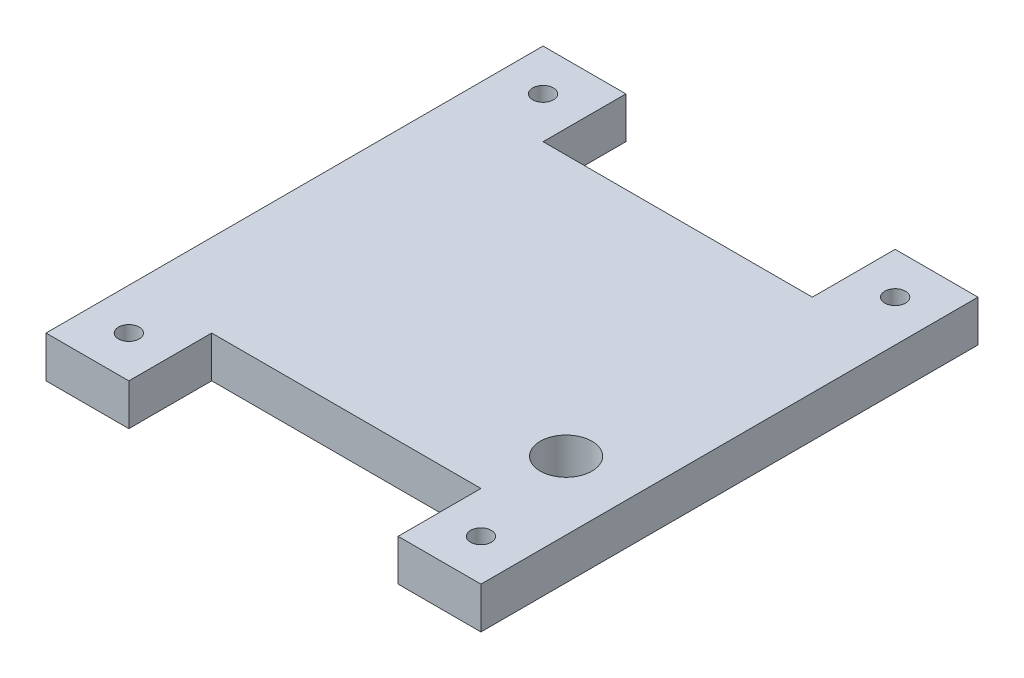
ISO-10303-21;
HEADER;
FILE_DESCRIPTION(('STEP AP214'),'2;1');
FILE_NAME('part.step','',(''),(''),'','','');
FILE_SCHEMA(('AUTOMOTIVE_DESIGN { 1 0 10303 214 1 1 1 1 }'));
ENDSEC;
DATA;
#1=APPLICATION_CONTEXT('core data for automotive mechanical design processes');
#2=APPLICATION_PROTOCOL_DEFINITION('international standard','automotive_design',2000,#1);
#3=PRODUCT_CONTEXT('',#1,'mechanical');
#4=PRODUCT('Part','Part','',(#3));
#5=PRODUCT_RELATED_PRODUCT_CATEGORY('part','',(#4));
#6=PRODUCT_DEFINITION_FORMATION('','',#4);
#7=PRODUCT_DEFINITION_CONTEXT('part definition',#1,'design');
#8=PRODUCT_DEFINITION('design','',#6,#7);
#9=PRODUCT_DEFINITION_SHAPE('','',#8);
#10=(LENGTH_UNIT() NAMED_UNIT(*) SI_UNIT(.MILLI.,.METRE.));
#11=(NAMED_UNIT(*) PLANE_ANGLE_UNIT() SI_UNIT($,.RADIAN.));
#12=(NAMED_UNIT(*) SI_UNIT($,.STERADIAN.) SOLID_ANGLE_UNIT());
#13=UNCERTAINTY_MEASURE_WITH_UNIT(LENGTH_MEASURE(1.E-05),#10,'distance_accuracy_value','');
#14=(GEOMETRIC_REPRESENTATION_CONTEXT(3) GLOBAL_UNCERTAINTY_ASSIGNED_CONTEXT((#13)) GLOBAL_UNIT_ASSIGNED_CONTEXT((#10,
#11,#12)) REPRESENTATION_CONTEXT('',''));
#15=CARTESIAN_POINT('',(0.,0.,0.));
#16=DIRECTION('',(0.,0.,1.));
#17=DIRECTION('',(1.,0.,0.));
#18=AXIS2_PLACEMENT_3D('',#15,#16,#17);
#19=CARTESIAN_POINT('',(10.9671828152516,6.24877820473917,0.));
#20=DIRECTION('',(1.,0.,0.));
#21=DIRECTION('',(0.,0.,-1.));
#22=AXIS2_PLACEMENT_3D('',#19,#20,#21);
#23=PLANE('',#22);
#24=DIRECTION('',(0.,0.,1.));
#25=VECTOR('',#24,1.);
#26=CARTESIAN_POINT('',(10.9671828152516,4.24877820473917,0.));
#27=LINE('',#26,#25);
#28=CARTESIAN_POINT('',(10.9671828152516,4.24877820473917,-11.5586342220204));
#29=VERTEX_POINT('',#28);
#30=CARTESIAN_POINT('',(10.9671828152516,4.24877820473917,12.4413657779796));
#31=VERTEX_POINT('',#30);
#32=EDGE_CURVE('E174',#29,#31,#27,.T.);
#33=ORIENTED_EDGE('',*,*,#32,.T.);
#34=DIRECTION('',(0.,-1.,0.));
#35=VECTOR('',#34,1.);
#36=CARTESIAN_POINT('',(10.9671828152516,6.24877820473917,12.4413657779796));
#37=LINE('',#36,#35);
#38=CARTESIAN_POINT('',(10.9671828152516,6.24877820473917,12.4413657779796));
#39=VERTEX_POINT('',#38);
#40=EDGE_CURVE('E11',#39,#31,#37,.T.);
#41=ORIENTED_EDGE('',*,*,#40,.F.);
#42=DIRECTION('',(0.,0.,1.));
#43=VECTOR('',#42,1.);
#44=CARTESIAN_POINT('',(10.9671828152516,6.24877820473917,0.));
#45=LINE('',#44,#43);
#46=CARTESIAN_POINT('',(10.9671828152516,6.24877820473917,-11.5586342220204));
#47=VERTEX_POINT('',#46);
#48=EDGE_CURVE('E209',#47,#39,#45,.T.);
#49=ORIENTED_EDGE('',*,*,#48,.F.);
#50=DIRECTION('',(0.,-1.,0.));
#51=VECTOR('',#50,1.);
#52=CARTESIAN_POINT('',(10.9671828152516,6.24877820473917,-11.5586342220204));
#53=LINE('',#52,#51);
#54=EDGE_CURVE('E173',#47,#29,#53,.T.);
#55=ORIENTED_EDGE('',*,*,#54,.T.);
#56=EDGE_LOOP('',(#33,#41,#49,#55));
#57=FACE_BOUND('',#56,.T.);
#58=ADVANCED_FACE('F41',(#57),#23,.F.);
#59=CARTESIAN_POINT('',(0.,6.24877820473917,12.4413657779796));
#60=DIRECTION('',(0.,0.,-1.));
#61=DIRECTION('',(-1.,0.,0.));
#62=AXIS2_PLACEMENT_3D('',#59,#60,#61);
#63=PLANE('',#62);
#64=DIRECTION('',(1.,0.,0.));
#65=VECTOR('',#64,1.);
#66=CARTESIAN_POINT('',(0.,4.24877820473917,12.4413657779796));
#67=LINE('',#66,#65);
#68=CARTESIAN_POINT('',(14.9671828152516,4.24877820473917,12.4413657779796));
#69=VERTEX_POINT('',#68);
#70=EDGE_CURVE('E177',#31,#69,#67,.T.);
#71=ORIENTED_EDGE('',*,*,#70,.T.);
#72=DIRECTION('',(0.,-1.,0.));
#73=VECTOR('',#72,1.);
#74=CARTESIAN_POINT('',(14.9671828152516,6.24877820473917,12.4413657779796));
#75=LINE('',#74,#73);
#76=CARTESIAN_POINT('',(14.9671828152516,6.24877820473917,12.4413657779796));
#77=VERTEX_POINT('',#76);
#78=EDGE_CURVE('E49',#77,#69,#75,.T.);
#79=ORIENTED_EDGE('',*,*,#78,.F.);
#80=DIRECTION('',(1.,0.,0.));
#81=VECTOR('',#80,1.);
#82=CARTESIAN_POINT('',(0.,6.24877820473917,12.4413657779796));
#83=LINE('',#82,#81);
#84=EDGE_CURVE('E112',#39,#77,#83,.T.);
#85=ORIENTED_EDGE('',*,*,#84,.F.);
#86=ORIENTED_EDGE('',*,*,#40,.T.);
#87=EDGE_LOOP('',(#71,#79,#85,#86));
#88=FACE_BOUND('',#87,.T.);
#89=ADVANCED_FACE('F293',(#88),#63,.F.);
#90=CARTESIAN_POINT('',(14.9671828152516,6.24877820473917,0.));
#91=DIRECTION('',(-1.,0.,0.));
#92=DIRECTION('',(0.,0.,1.));
#93=AXIS2_PLACEMENT_3D('',#90,#91,#92);
#94=PLANE('',#93);
#95=DIRECTION('',(0.,0.,-1.));
#96=VECTOR('',#95,1.);
#97=CARTESIAN_POINT('',(14.9671828152516,4.24877820473917,0.));
#98=LINE('',#97,#96);
#99=CARTESIAN_POINT('',(14.9671828152516,4.24877820473917,8.44136577797956));
#100=VERTEX_POINT('',#99);
#101=EDGE_CURVE('E180',#69,#100,#98,.T.);
#102=ORIENTED_EDGE('',*,*,#101,.T.);
#103=DIRECTION('',(0.,-1.,0.));
#104=VECTOR('',#103,1.);
#105=CARTESIAN_POINT('',(14.9671828152516,6.24877820473917,8.44136577797956));
#106=LINE('',#105,#104);
#107=CARTESIAN_POINT('',(14.9671828152516,6.24877820473917,8.44136577797956));
#108=VERTEX_POINT('',#107);
#109=EDGE_CURVE('E228',#108,#100,#106,.T.);
#110=ORIENTED_EDGE('',*,*,#109,.F.);
#111=DIRECTION('',(0.,0.,-1.));
#112=VECTOR('',#111,1.);
#113=CARTESIAN_POINT('',(14.9671828152516,6.24877820473917,0.));
#114=LINE('',#113,#112);
#115=EDGE_CURVE('E236',#77,#108,#114,.T.);
#116=ORIENTED_EDGE('',*,*,#115,.F.);
#117=ORIENTED_EDGE('',*,*,#78,.T.);
#118=EDGE_LOOP('',(#102,#110,#116,#117));
#119=FACE_BOUND('',#118,.T.);
#120=ADVANCED_FACE('F234',(#119),#94,.F.);
#121=CARTESIAN_POINT('',(0.,6.24877820473917,8.44136577797956));
#122=DIRECTION('',(0.,0.,-1.));
#123=DIRECTION('',(-1.,0.,0.));
#124=AXIS2_PLACEMENT_3D('',#121,#122,#123);
#125=PLANE('',#124);
#126=DIRECTION('',(1.,0.,0.));
#127=VECTOR('',#126,1.);
#128=CARTESIAN_POINT('',(0.,4.24877820473917,8.44136577797956));
#129=LINE('',#128,#127);
#130=CARTESIAN_POINT('',(27.9671828152516,4.24877820473917,8.44136577797956));
#131=VERTEX_POINT('',#130);
#132=EDGE_CURVE('E182',#100,#131,#129,.T.);
#133=ORIENTED_EDGE('',*,*,#132,.T.);
#134=DIRECTION('',(0.,-1.,0.));
#135=VECTOR('',#134,1.);
#136=CARTESIAN_POINT('',(27.9671828152516,6.24877820473917,8.44136577797956));
#137=LINE('',#136,#135);
#138=CARTESIAN_POINT('',(27.9671828152516,6.24877820473917,8.44136577797956));
#139=VERTEX_POINT('',#138);
#140=EDGE_CURVE('E225',#139,#131,#137,.T.);
#141=ORIENTED_EDGE('',*,*,#140,.F.);
#142=DIRECTION('',(1.,0.,0.));
#143=VECTOR('',#142,1.);
#144=CARTESIAN_POINT('',(0.,6.24877820473917,8.44136577797956));
#145=LINE('',#144,#143);
#146=EDGE_CURVE('E255',#108,#139,#145,.T.);
#147=ORIENTED_EDGE('',*,*,#146,.F.);
#148=ORIENTED_EDGE('',*,*,#109,.T.);
#149=EDGE_LOOP('',(#133,#141,#147,#148));
#150=FACE_BOUND('',#149,.T.);
#151=ADVANCED_FACE('F246',(#150),#125,.F.);
#152=CARTESIAN_POINT('',(27.9671828152516,6.24877820473917,0.));
#153=DIRECTION('',(1.,0.,0.));
#154=DIRECTION('',(0.,0.,-1.));
#155=AXIS2_PLACEMENT_3D('',#152,#153,#154);
#156=PLANE('',#155);
#157=DIRECTION('',(0.,0.,1.));
#158=VECTOR('',#157,1.);
#159=CARTESIAN_POINT('',(27.9671828152516,4.24877820473917,0.));
#160=LINE('',#159,#158);
#161=CARTESIAN_POINT('',(27.9671828152516,4.24877820473917,12.4413657779796));
#162=VERTEX_POINT('',#161);
#163=EDGE_CURVE('E184',#131,#162,#160,.T.);
#164=ORIENTED_EDGE('',*,*,#163,.T.);
#165=DIRECTION('',(0.,-1.,0.));
#166=VECTOR('',#165,1.);
#167=CARTESIAN_POINT('',(27.9671828152516,6.24877820473917,12.4413657779796));
#168=LINE('',#167,#166);
#169=CARTESIAN_POINT('',(27.9671828152516,6.24877820473917,12.4413657779796));
#170=VERTEX_POINT('',#169);
#171=EDGE_CURVE('E222',#170,#162,#168,.T.);
#172=ORIENTED_EDGE('',*,*,#171,.F.);
#173=DIRECTION('',(0.,0.,1.));
#174=VECTOR('',#173,1.);
#175=CARTESIAN_POINT('',(27.9671828152516,6.24877820473917,0.));
#176=LINE('',#175,#174);
#177=EDGE_CURVE('E252',#139,#170,#176,.T.);
#178=ORIENTED_EDGE('',*,*,#177,.F.);
#179=ORIENTED_EDGE('',*,*,#140,.T.);
#180=EDGE_LOOP('',(#164,#172,#178,#179));
#181=FACE_BOUND('',#180,.T.);
#182=ADVANCED_FACE('F250',(#181),#156,.F.);
#183=CARTESIAN_POINT('',(0.,6.24877820473917,12.4413657779796));
#184=DIRECTION('',(0.,0.,-1.));
#185=DIRECTION('',(-1.,0.,0.));
#186=AXIS2_PLACEMENT_3D('',#183,#184,#185);
#187=PLANE('',#186);
#188=DIRECTION('',(1.,0.,0.));
#189=VECTOR('',#188,1.);
#190=CARTESIAN_POINT('',(0.,4.24877820473917,12.4413657779796));
#191=LINE('',#190,#189);
#192=CARTESIAN_POINT('',(31.9671828152516,4.24877820473917,12.4413657779796));
#193=VERTEX_POINT('',#192);
#194=EDGE_CURVE('E186',#162,#193,#191,.T.);
#195=ORIENTED_EDGE('',*,*,#194,.T.);
#196=DIRECTION('',(0.,-1.,0.));
#197=VECTOR('',#196,1.);
#198=CARTESIAN_POINT('',(31.9671828152516,6.24877820473917,12.4413657779796));
#199=LINE('',#198,#197);
#200=CARTESIAN_POINT('',(31.9671828152516,6.24877820473917,12.4413657779796));
#201=VERTEX_POINT('',#200);
#202=EDGE_CURVE('E219',#201,#193,#199,.T.);
#203=ORIENTED_EDGE('',*,*,#202,.F.);
#204=DIRECTION('',(1.,0.,0.));
#205=VECTOR('',#204,1.);
#206=CARTESIAN_POINT('',(0.,6.24877820473917,12.4413657779796));
#207=LINE('',#206,#205);
#208=EDGE_CURVE('E254',#170,#201,#207,.T.);
#209=ORIENTED_EDGE('',*,*,#208,.F.);
#210=ORIENTED_EDGE('',*,*,#171,.T.);
#211=EDGE_LOOP('',(#195,#203,#209,#210));
#212=FACE_BOUND('',#211,.T.);
#213=ADVANCED_FACE('F306',(#212),#187,.F.);
#214=CARTESIAN_POINT('',(31.9671828152516,6.24877820473917,0.));
#215=DIRECTION('',(-1.,0.,0.));
#216=DIRECTION('',(0.,0.,1.));
#217=AXIS2_PLACEMENT_3D('',#214,#215,#216);
#218=PLANE('',#217);
#219=DIRECTION('',(0.,0.,-1.));
#220=VECTOR('',#219,1.);
#221=CARTESIAN_POINT('',(31.9671828152516,4.24877820473917,0.));
#222=LINE('',#221,#220);
#223=CARTESIAN_POINT('',(31.9671828152516,4.24877820473917,-11.5586342220204));
#224=VERTEX_POINT('',#223);
#225=EDGE_CURVE('E188',#193,#224,#222,.T.);
#226=ORIENTED_EDGE('',*,*,#225,.T.);
#227=DIRECTION('',(0.,-1.,0.));
#228=VECTOR('',#227,1.);
#229=CARTESIAN_POINT('',(31.9671828152516,6.24877820473917,-11.5586342220204));
#230=LINE('',#229,#228);
#231=CARTESIAN_POINT('',(31.9671828152516,6.24877820473917,-11.5586342220204));
#232=VERTEX_POINT('',#231);
#233=EDGE_CURVE('E216',#232,#224,#230,.T.);
#234=ORIENTED_EDGE('',*,*,#233,.F.);
#235=DIRECTION('',(0.,0.,-1.));
#236=VECTOR('',#235,1.);
#237=CARTESIAN_POINT('',(31.9671828152516,6.24877820473917,0.));
#238=LINE('',#237,#236);
#239=EDGE_CURVE('E257',#201,#232,#238,.T.);
#240=ORIENTED_EDGE('',*,*,#239,.F.);
#241=ORIENTED_EDGE('',*,*,#202,.T.);
#242=EDGE_LOOP('',(#226,#234,#240,#241));
#243=FACE_BOUND('',#242,.T.);
#244=ADVANCED_FACE('F309',(#243),#218,.F.);
#245=CARTESIAN_POINT('',(0.,6.24877820473917,-11.5586342220204));
#246=DIRECTION('',(0.,0.,1.));
#247=DIRECTION('',(1.,0.,0.));
#248=AXIS2_PLACEMENT_3D('',#245,#246,#247);
#249=PLANE('',#248);
#250=DIRECTION('',(-1.,0.,0.));
#251=VECTOR('',#250,1.);
#252=CARTESIAN_POINT('',(0.,4.24877820473917,-11.5586342220204));
#253=LINE('',#252,#251);
#254=CARTESIAN_POINT('',(27.9671828152516,4.24877820473917,-11.5586342220204));
#255=VERTEX_POINT('',#254);
#256=EDGE_CURVE('E190',#224,#255,#253,.T.);
#257=ORIENTED_EDGE('',*,*,#256,.T.);
#258=DIRECTION('',(0.,-1.,0.));
#259=VECTOR('',#258,1.);
#260=CARTESIAN_POINT('',(27.9671828152516,6.24877820473917,-11.5586342220204));
#261=LINE('',#260,#259);
#262=CARTESIAN_POINT('',(27.9671828152516,6.24877820473917,-11.5586342220204));
#263=VERTEX_POINT('',#262);
#264=EDGE_CURVE('E213',#263,#255,#261,.T.);
#265=ORIENTED_EDGE('',*,*,#264,.F.);
#266=DIRECTION('',(-1.,0.,0.));
#267=VECTOR('',#266,1.);
#268=CARTESIAN_POINT('',(0.,6.24877820473917,-11.5586342220204));
#269=LINE('',#268,#267);
#270=EDGE_CURVE('E263',#232,#263,#269,.T.);
#271=ORIENTED_EDGE('',*,*,#270,.F.);
#272=ORIENTED_EDGE('',*,*,#233,.T.);
#273=EDGE_LOOP('',(#257,#265,#271,#272));
#274=FACE_BOUND('',#273,.T.);
#275=ADVANCED_FACE('F269',(#274),#249,.F.);
#276=CARTESIAN_POINT('',(27.9671828152516,6.24877820473917,0.));
#277=DIRECTION('',(1.,0.,0.));
#278=DIRECTION('',(0.,0.,-1.));
#279=AXIS2_PLACEMENT_3D('',#276,#277,#278);
#280=PLANE('',#279);
#281=DIRECTION('',(0.,0.,1.));
#282=VECTOR('',#281,1.);
#283=CARTESIAN_POINT('',(27.9671828152516,4.24877820473917,0.));
#284=LINE('',#283,#282);
#285=CARTESIAN_POINT('',(27.9671828152516,4.24877820473917,-7.55863422202044));
#286=VERTEX_POINT('',#285);
#287=EDGE_CURVE('E192',#255,#286,#284,.T.);
#288=ORIENTED_EDGE('',*,*,#287,.T.);
#289=DIRECTION('',(0.,-1.,0.));
#290=VECTOR('',#289,1.);
#291=CARTESIAN_POINT('',(27.9671828152516,6.24877820473917,-7.55863422202044));
#292=LINE('',#291,#290);
#293=CARTESIAN_POINT('',(27.9671828152516,6.24877820473917,-7.55863422202044));
#294=VERTEX_POINT('',#293);
#295=EDGE_CURVE('E153',#294,#286,#292,.T.);
#296=ORIENTED_EDGE('',*,*,#295,.F.);
#297=DIRECTION('',(0.,0.,1.));
#298=VECTOR('',#297,1.);
#299=CARTESIAN_POINT('',(27.9671828152516,6.24877820473917,0.));
#300=LINE('',#299,#298);
#301=EDGE_CURVE('E144',#263,#294,#300,.T.);
#302=ORIENTED_EDGE('',*,*,#301,.F.);
#303=ORIENTED_EDGE('',*,*,#264,.T.);
#304=EDGE_LOOP('',(#288,#296,#302,#303));
#305=FACE_BOUND('',#304,.T.);
#306=ADVANCED_FACE('F273',(#305),#280,.F.);
#307=CARTESIAN_POINT('',(0.,6.24877820473917,-7.55863422202044));
#308=DIRECTION('',(0.,0.,1.));
#309=DIRECTION('',(1.,0.,0.));
#310=AXIS2_PLACEMENT_3D('',#307,#308,#309);
#311=PLANE('',#310);
#312=DIRECTION('',(-1.,0.,0.));
#313=VECTOR('',#312,1.);
#314=CARTESIAN_POINT('',(0.,4.24877820473917,-7.55863422202044));
#315=LINE('',#314,#313);
#316=CARTESIAN_POINT('',(14.9671828152516,4.24877820473917,-7.55863422202044));
#317=VERTEX_POINT('',#316);
#318=EDGE_CURVE('E152',#286,#317,#315,.T.);
#319=ORIENTED_EDGE('',*,*,#318,.T.);
#320=DIRECTION('',(0.,-1.,0.));
#321=VECTOR('',#320,1.);
#322=CARTESIAN_POINT('',(14.9671828152516,6.24877820473917,-7.55863422202044));
#323=LINE('',#322,#321);
#324=CARTESIAN_POINT('',(14.9671828152516,6.24877820473917,-7.55863422202044));
#325=VERTEX_POINT('',#324);
#326=EDGE_CURVE('E149',#325,#317,#323,.T.);
#327=ORIENTED_EDGE('',*,*,#326,.F.);
#328=DIRECTION('',(-1.,0.,0.));
#329=VECTOR('',#328,1.);
#330=CARTESIAN_POINT('',(0.,6.24877820473917,-7.55863422202044));
#331=LINE('',#330,#329);
#332=EDGE_CURVE('E137',#294,#325,#331,.T.);
#333=ORIENTED_EDGE('',*,*,#332,.F.);
#334=ORIENTED_EDGE('',*,*,#295,.T.);
#335=EDGE_LOOP('',(#319,#327,#333,#334));
#336=FACE_BOUND('',#335,.T.);
#337=ADVANCED_FACE('F150',(#336),#311,.F.);
#338=CARTESIAN_POINT('',(14.9671828152516,6.24877820473917,0.));
#339=DIRECTION('',(-1.,0.,0.));
#340=DIRECTION('',(0.,0.,1.));
#341=AXIS2_PLACEMENT_3D('',#338,#339,#340);
#342=PLANE('',#341);
#343=DIRECTION('',(0.,0.,-1.));
#344=VECTOR('',#343,1.);
#345=CARTESIAN_POINT('',(14.9671828152516,4.24877820473917,0.));
#346=LINE('',#345,#344);
#347=CARTESIAN_POINT('',(14.9671828152516,4.24877820473917,-11.5586342220204));
#348=VERTEX_POINT('',#347);
#349=EDGE_CURVE('E98',#317,#348,#346,.T.);
#350=ORIENTED_EDGE('',*,*,#349,.T.);
#351=DIRECTION('',(0.,-1.,0.));
#352=VECTOR('',#351,1.);
#353=CARTESIAN_POINT('',(14.9671828152516,6.24877820473917,-11.5586342220204));
#354=LINE('',#353,#352);
#355=CARTESIAN_POINT('',(14.9671828152516,6.24877820473917,-11.5586342220204));
#356=VERTEX_POINT('',#355);
#357=EDGE_CURVE('E154',#356,#348,#354,.T.);
#358=ORIENTED_EDGE('',*,*,#357,.F.);
#359=DIRECTION('',(0.,0.,-1.));
#360=VECTOR('',#359,1.);
#361=CARTESIAN_POINT('',(14.9671828152516,6.24877820473917,0.));
#362=LINE('',#361,#360);
#363=EDGE_CURVE('E142',#325,#356,#362,.T.);
#364=ORIENTED_EDGE('',*,*,#363,.F.);
#365=ORIENTED_EDGE('',*,*,#326,.T.);
#366=EDGE_LOOP('',(#350,#358,#364,#365));
#367=FACE_BOUND('',#366,.T.);
#368=ADVANCED_FACE('F156',(#367),#342,.F.);
#369=CARTESIAN_POINT('',(29.9671828152516,6.24877820473917,10.4413657779796));
#370=DIRECTION('',(0.,-1.,0.));
#371=DIRECTION('',(0.,0.,-1.));
#372=AXIS2_PLACEMENT_3D('',#369,#370,#371);
#373=CYLINDRICAL_SURFACE('',#372,0.5);
#374=CARTESIAN_POINT('',(29.9671828152516,6.24877820473917,10.4413657779796));
#375=DIRECTION('',(0.,1.,0.));
#376=DIRECTION('',(0.,0.,1.));
#377=AXIS2_PLACEMENT_3D('',#374,#375,#376);
#378=CIRCLE('',#377,0.5);
#379=CARTESIAN_POINT('',(29.9671828152516,6.24877820473917,10.9413657779796));
#380=VERTEX_POINT('',#379);
#381=EDGE_CURVE('E167',#380,#380,#378,.F.);
#382=ORIENTED_EDGE('',*,*,#381,.F.);
#383=EDGE_LOOP('',(#382));
#384=FACE_BOUND('',#383,.T.);
#385=CARTESIAN_POINT('',(29.9671828152516,4.24877820473917,10.4413657779796));
#386=DIRECTION('',(0.,1.,0.));
#387=DIRECTION('',(0.,0.,1.));
#388=AXIS2_PLACEMENT_3D('',#385,#386,#387);
#389=CIRCLE('',#388,0.5);
#390=CARTESIAN_POINT('',(29.9671828152516,4.24877820473917,10.9413657779796));
#391=VERTEX_POINT('',#390);
#392=EDGE_CURVE('E203',#391,#391,#389,.F.);
#393=ORIENTED_EDGE('',*,*,#392,.T.);
#394=EDGE_LOOP('',(#393));
#395=FACE_BOUND('',#394,.T.);
#396=ADVANCED_FACE('F320',(#384,#395),#373,.F.);
#397=CARTESIAN_POINT('',(29.9671828152516,6.24877820473917,-9.55863422202044));
#398=DIRECTION('',(0.,-1.,0.));
#399=DIRECTION('',(0.,0.,-1.));
#400=AXIS2_PLACEMENT_3D('',#397,#398,#399);
#401=CYLINDRICAL_SURFACE('',#400,0.499999999999999);
#402=CARTESIAN_POINT('',(29.9671828152516,6.24877820473917,-9.55863422202044));
#403=DIRECTION('',(0.,1.,0.));
#404=DIRECTION('',(0.,0.,1.));
#405=AXIS2_PLACEMENT_3D('',#402,#403,#404);
#406=CIRCLE('',#405,0.499999999999999);
#407=CARTESIAN_POINT('',(29.9671828152516,6.24877820473917,-9.05863422202044));
#408=VERTEX_POINT('',#407);
#409=EDGE_CURVE('E164',#408,#408,#406,.T.);
#410=ORIENTED_EDGE('',*,*,#409,.T.);
#411=EDGE_LOOP('',(#410));
#412=FACE_BOUND('',#411,.T.);
#413=CARTESIAN_POINT('',(29.9671828152516,4.24877820473917,-9.55863422202044));
#414=DIRECTION('',(0.,1.,0.));
#415=DIRECTION('',(0.,0.,1.));
#416=AXIS2_PLACEMENT_3D('',#413,#414,#415);
#417=CIRCLE('',#416,0.499999999999999);
#418=CARTESIAN_POINT('',(29.9671828152516,4.24877820473917,-9.05863422202044));
#419=VERTEX_POINT('',#418);
#420=EDGE_CURVE('E200',#419,#419,#417,.T.);
#421=ORIENTED_EDGE('',*,*,#420,.F.);
#422=EDGE_LOOP('',(#421));
#423=FACE_BOUND('',#422,.T.);
#424=ADVANCED_FACE('F288',(#412,#423),#401,.F.);
#425=CARTESIAN_POINT('',(12.9671828152516,6.24877820473917,-9.55863422202044));
#426=DIRECTION('',(0.,-1.,0.));
#427=DIRECTION('',(0.,0.,-1.));
#428=AXIS2_PLACEMENT_3D('',#425,#426,#427);
#429=CYLINDRICAL_SURFACE('',#428,0.499999999999999);
#430=CARTESIAN_POINT('',(12.9671828152516,6.24877820473917,-9.55863422202044));
#431=DIRECTION('',(0.,1.,0.));
#432=DIRECTION('',(0.,0.,1.));
#433=AXIS2_PLACEMENT_3D('',#430,#431,#432);
#434=CIRCLE('',#433,0.499999999999999);
#435=CARTESIAN_POINT('',(12.9671828152516,6.24877820473917,-9.05863422202044));
#436=VERTEX_POINT('',#435);
#437=EDGE_CURVE('E158',#436,#436,#434,.T.);
#438=ORIENTED_EDGE('',*,*,#437,.T.);
#439=EDGE_LOOP('',(#438));
#440=FACE_BOUND('',#439,.T.);
#441=CARTESIAN_POINT('',(12.9671828152516,4.24877820473917,-9.55863422202044));
#442=DIRECTION('',(0.,1.,0.));
#443=DIRECTION('',(0.,0.,1.));
#444=AXIS2_PLACEMENT_3D('',#441,#442,#443);
#445=CIRCLE('',#444,0.499999999999999);
#446=CARTESIAN_POINT('',(12.9671828152516,4.24877820473917,-9.05863422202044));
#447=VERTEX_POINT('',#446);
#448=EDGE_CURVE('E197',#447,#447,#445,.T.);
#449=ORIENTED_EDGE('',*,*,#448,.F.);
#450=EDGE_LOOP('',(#449));
#451=FACE_BOUND('',#450,.T.);
#452=ADVANCED_FACE('F280',(#440,#451),#429,.F.);
#453=CARTESIAN_POINT('',(0.,6.24877820473917,-11.5586342220204));
#454=DIRECTION('',(0.,0.,1.));
#455=DIRECTION('',(1.,0.,0.));
#456=AXIS2_PLACEMENT_3D('',#453,#454,#455);
#457=PLANE('',#456);
#458=DIRECTION('',(-1.,0.,0.));
#459=VECTOR('',#458,1.);
#460=CARTESIAN_POINT('',(0.,4.24877820473917,-11.5586342220204));
#461=LINE('',#460,#459);
#462=EDGE_CURVE('E104',#348,#29,#461,.T.);
#463=ORIENTED_EDGE('',*,*,#462,.T.);
#464=ORIENTED_EDGE('',*,*,#54,.F.);
#465=DIRECTION('',(-1.,0.,0.));
#466=VECTOR('',#465,1.);
#467=CARTESIAN_POINT('',(0.,6.24877820473917,-11.5586342220204));
#468=LINE('',#467,#466);
#469=EDGE_CURVE('E57',#356,#47,#468,.T.);
#470=ORIENTED_EDGE('',*,*,#469,.F.);
#471=ORIENTED_EDGE('',*,*,#357,.T.);
#472=EDGE_LOOP('',(#463,#464,#470,#471));
#473=FACE_BOUND('',#472,.T.);
#474=ADVANCED_FACE('F277',(#473),#457,.F.);
#475=CARTESIAN_POINT('',(12.9671828152516,6.24877820473917,10.4413657779796));
#476=DIRECTION('',(0.,-1.,0.));
#477=DIRECTION('',(0.,0.,-1.));
#478=AXIS2_PLACEMENT_3D('',#475,#476,#477);
#479=CYLINDRICAL_SURFACE('',#478,0.499999999999999);
#480=CARTESIAN_POINT('',(12.9671828152516,6.24877820473917,10.4413657779796));
#481=DIRECTION('',(0.,1.,0.));
#482=DIRECTION('',(0.,0.,1.));
#483=AXIS2_PLACEMENT_3D('',#480,#481,#482);
#484=CIRCLE('',#483,0.499999999999999);
#485=CARTESIAN_POINT('',(12.9671828152516,6.24877820473917,10.9413657779796));
#486=VERTEX_POINT('',#485);
#487=EDGE_CURVE('E170',#486,#486,#484,.F.);
#488=ORIENTED_EDGE('',*,*,#487,.F.);
#489=EDGE_LOOP('',(#488));
#490=FACE_BOUND('',#489,.T.);
#491=CARTESIAN_POINT('',(12.9671828152516,4.24877820473917,10.4413657779796));
#492=DIRECTION('',(0.,1.,0.));
#493=DIRECTION('',(0.,0.,1.));
#494=AXIS2_PLACEMENT_3D('',#491,#492,#493);
#495=CIRCLE('',#494,0.499999999999999);
#496=CARTESIAN_POINT('',(12.9671828152516,4.24877820473917,10.9413657779796));
#497=VERTEX_POINT('',#496);
#498=EDGE_CURVE('E206',#497,#497,#495,.F.);
#499=ORIENTED_EDGE('',*,*,#498,.T.);
#500=EDGE_LOOP('',(#499));
#501=FACE_BOUND('',#500,.T.);
#502=ADVANCED_FACE('F279',(#490,#501),#479,.F.);
#503=CARTESIAN_POINT('',(0.,6.24877820473917,0.));
#504=DIRECTION('',(0.,1.,0.));
#505=DIRECTION('',(0.,0.,1.));
#506=AXIS2_PLACEMENT_3D('',#503,#504,#505);
#507=PLANE('',#506);
#508=CARTESIAN_POINT('',(28.6728434061754,6.24877820473917,5.03462227485096));
#509=DIRECTION('',(0.,1.,0.));
#510=DIRECTION('',(0.,0.,1.));
#511=AXIS2_PLACEMENT_3D('',#508,#509,#510);
#512=CIRCLE('',#511,1.25);
#513=CARTESIAN_POINT('',(28.6728434061754,6.24877820473917,6.28462227485096));
#514=VERTEX_POINT('',#513);
#515=EDGE_CURVE('E350',#514,#514,#512,.T.);
#516=ORIENTED_EDGE('',*,*,#515,.F.);
#517=EDGE_LOOP('',(#516));
#518=FACE_BOUND('',#517,.T.);
#519=ORIENTED_EDGE('',*,*,#48,.T.);
#520=ORIENTED_EDGE('',*,*,#84,.T.);
#521=ORIENTED_EDGE('',*,*,#115,.T.);
#522=ORIENTED_EDGE('',*,*,#146,.T.);
#523=ORIENTED_EDGE('',*,*,#177,.T.);
#524=ORIENTED_EDGE('',*,*,#208,.T.);
#525=ORIENTED_EDGE('',*,*,#239,.T.);
#526=ORIENTED_EDGE('',*,*,#270,.T.);
#527=ORIENTED_EDGE('',*,*,#301,.T.);
#528=ORIENTED_EDGE('',*,*,#332,.T.);
#529=ORIENTED_EDGE('',*,*,#363,.T.);
#530=ORIENTED_EDGE('',*,*,#469,.T.);
#531=EDGE_LOOP('',(#519,#520,#521,#522,#523,#524,#525,#526,#527,#528,#529,#530));
#532=FACE_BOUND('',#531,.T.);
#533=ORIENTED_EDGE('',*,*,#437,.F.);
#534=EDGE_LOOP('',(#533));
#535=FACE_BOUND('',#534,.T.);
#536=ORIENTED_EDGE('',*,*,#409,.F.);
#537=EDGE_LOOP('',(#536));
#538=FACE_BOUND('',#537,.T.);
#539=ORIENTED_EDGE('',*,*,#381,.T.);
#540=EDGE_LOOP('',(#539));
#541=FACE_BOUND('',#540,.T.);
#542=ORIENTED_EDGE('',*,*,#487,.T.);
#543=EDGE_LOOP('',(#542));
#544=FACE_BOUND('',#543,.T.);
#545=ADVANCED_FACE('F139',(#518,#532,#535,#538,#541,#544),#507,.T.);
#546=CARTESIAN_POINT('',(0.,4.24877820473917,0.));
#547=DIRECTION('',(0.,1.,0.));
#548=DIRECTION('',(0.,0.,1.));
#549=AXIS2_PLACEMENT_3D('',#546,#547,#548);
#550=PLANE('',#549);
#551=CARTESIAN_POINT('',(28.6728434061754,4.24877820473917,5.03462227485096));
#552=DIRECTION('',(0.,1.,0.));
#553=DIRECTION('',(0.,0.,1.));
#554=AXIS2_PLACEMENT_3D('',#551,#552,#553);
#555=CIRCLE('',#554,1.25);
#556=CARTESIAN_POINT('',(28.6728434061754,4.24877820473917,6.28462227485096));
#557=VERTEX_POINT('',#556);
#558=EDGE_CURVE('E178',#557,#557,#555,.T.);
#559=ORIENTED_EDGE('',*,*,#558,.T.);
#560=EDGE_LOOP('',(#559));
#561=FACE_BOUND('',#560,.T.);
#562=ORIENTED_EDGE('',*,*,#32,.F.);
#563=ORIENTED_EDGE('',*,*,#462,.F.);
#564=ORIENTED_EDGE('',*,*,#349,.F.);
#565=ORIENTED_EDGE('',*,*,#318,.F.);
#566=ORIENTED_EDGE('',*,*,#287,.F.);
#567=ORIENTED_EDGE('',*,*,#256,.F.);
#568=ORIENTED_EDGE('',*,*,#225,.F.);
#569=ORIENTED_EDGE('',*,*,#194,.F.);
#570=ORIENTED_EDGE('',*,*,#163,.F.);
#571=ORIENTED_EDGE('',*,*,#132,.F.);
#572=ORIENTED_EDGE('',*,*,#101,.F.);
#573=ORIENTED_EDGE('',*,*,#70,.F.);
#574=EDGE_LOOP('',(#562,#563,#564,#565,#566,#567,#568,#569,#570,#571,#572,#573));
#575=FACE_BOUND('',#574,.T.);
#576=ORIENTED_EDGE('',*,*,#448,.T.);
#577=EDGE_LOOP('',(#576));
#578=FACE_BOUND('',#577,.T.);
#579=ORIENTED_EDGE('',*,*,#420,.T.);
#580=EDGE_LOOP('',(#579));
#581=FACE_BOUND('',#580,.T.);
#582=ORIENTED_EDGE('',*,*,#392,.F.);
#583=EDGE_LOOP('',(#582));
#584=FACE_BOUND('',#583,.T.);
#585=ORIENTED_EDGE('',*,*,#498,.F.);
#586=EDGE_LOOP('',(#585));
#587=FACE_BOUND('',#586,.T.);
#588=ADVANCED_FACE('F240',(#561,#575,#578,#581,#584,#587),#550,.F.);
#589=CARTESIAN_POINT('',(28.6728434061754,4.24877820473917,5.03462227485096));
#590=DIRECTION('',(0.,1.,0.));
#591=DIRECTION('',(0.,0.,1.));
#592=AXIS2_PLACEMENT_3D('',#589,#590,#591);
#593=CYLINDRICAL_SURFACE('',#592,1.25);
#594=ORIENTED_EDGE('',*,*,#558,.F.);
#595=EDGE_LOOP('',(#594));
#596=FACE_BOUND('',#595,.T.);
#597=ORIENTED_EDGE('',*,*,#515,.T.);
#598=EDGE_LOOP('',(#597));
#599=FACE_BOUND('',#598,.T.);
#600=ADVANCED_FACE('F336',(#596,#599),#593,.F.);
#601=CLOSED_SHELL('',(#58,#89,#120,#151,#182,#213,#244,#275,#306,#337,#368,#396,#424,#452,#474,
#502,#545,#588,#600));
#602=MANIFOLD_SOLID_BREP('B2',#601);
#603=ADVANCED_BREP_SHAPE_REPRESENTATION('',(#18,#602),#14);
#604=SHAPE_DEFINITION_REPRESENTATION(#9,#603);
ENDSEC;
END-ISO-10303-21;
